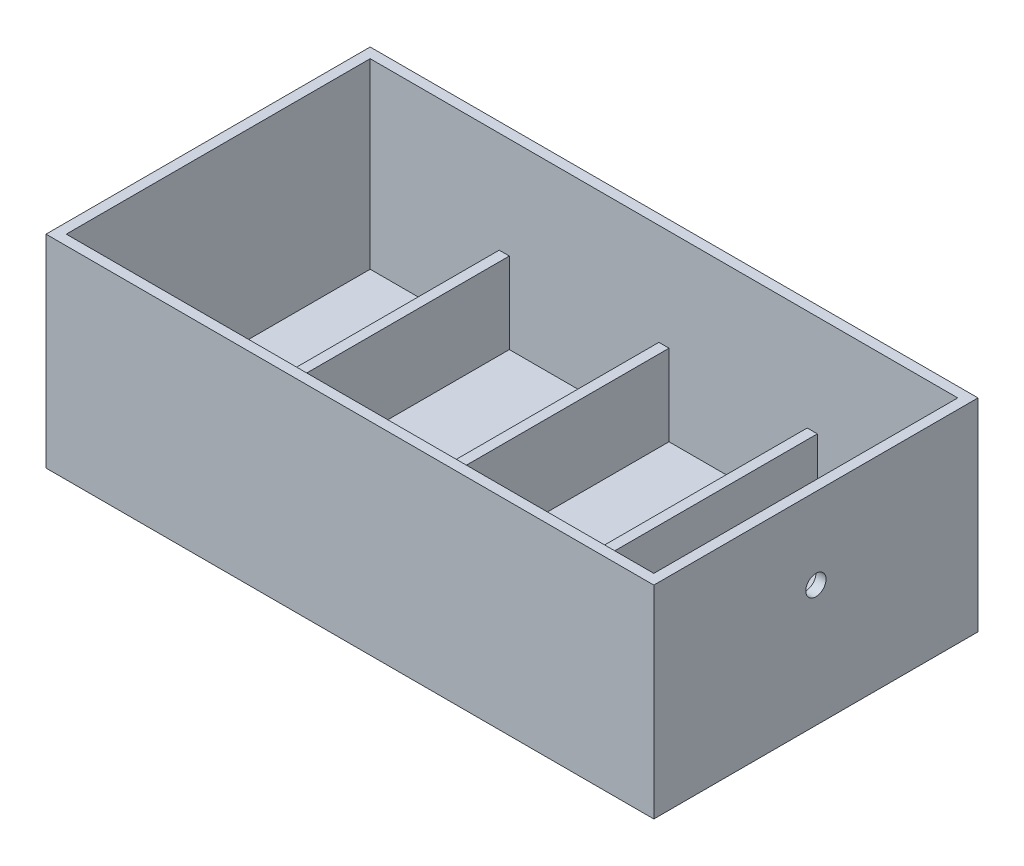
ISO-10303-21;
HEADER;
FILE_DESCRIPTION(('STEP AP214'),'2;1');
FILE_NAME('part.step','',(''),(''),'','','');
FILE_SCHEMA(('AUTOMOTIVE_DESIGN { 1 0 10303 214 1 1 1 1 }'));
ENDSEC;
DATA;
#1=APPLICATION_CONTEXT('core data for automotive mechanical design processes');
#2=APPLICATION_PROTOCOL_DEFINITION('international standard','automotive_design',2000,#1);
#3=PRODUCT_CONTEXT('',#1,'mechanical');
#4=PRODUCT('Part','Part','',(#3));
#5=PRODUCT_RELATED_PRODUCT_CATEGORY('part','',(#4));
#6=PRODUCT_DEFINITION_FORMATION('','',#4);
#7=PRODUCT_DEFINITION_CONTEXT('part definition',#1,'design');
#8=PRODUCT_DEFINITION('design','',#6,#7);
#9=PRODUCT_DEFINITION_SHAPE('','',#8);
#10=(LENGTH_UNIT() NAMED_UNIT(*) SI_UNIT(.MILLI.,.METRE.));
#11=(NAMED_UNIT(*) PLANE_ANGLE_UNIT() SI_UNIT($,.RADIAN.));
#12=(NAMED_UNIT(*) SI_UNIT($,.STERADIAN.) SOLID_ANGLE_UNIT());
#13=UNCERTAINTY_MEASURE_WITH_UNIT(LENGTH_MEASURE(1.E-05),#10,'distance_accuracy_value','');
#14=(GEOMETRIC_REPRESENTATION_CONTEXT(3) GLOBAL_UNCERTAINTY_ASSIGNED_CONTEXT((#13)) GLOBAL_UNIT_ASSIGNED_CONTEXT((#10,
#11,#12)) REPRESENTATION_CONTEXT('',''));
#15=CARTESIAN_POINT('',(0.,0.,0.));
#16=DIRECTION('',(0.,0.,1.));
#17=DIRECTION('',(1.,0.,0.));
#18=AXIS2_PLACEMENT_3D('',#15,#16,#17);
#19=CARTESIAN_POINT('',(72.5,5.,-37.5));
#20=DIRECTION('',(0.,0.,-1.));
#21=DIRECTION('',(-1.,0.,0.));
#22=AXIS2_PLACEMENT_3D('',#19,#20,#21);
#23=PLANE('',#22);
#24=DIRECTION('',(0.,-1.,0.));
#25=VECTOR('',#24,1.);
#26=CARTESIAN_POINT('',(35.3563232035454,25.,-37.5));
#27=LINE('',#26,#25);
#28=CARTESIAN_POINT('',(35.3563232035454,25.,-37.5));
#29=VERTEX_POINT('',#28);
#30=CARTESIAN_POINT('',(35.3563232035454,5.,-37.5));
#31=VERTEX_POINT('',#30);
#32=EDGE_CURVE('E213',#29,#31,#27,.T.);
#33=ORIENTED_EDGE('',*,*,#32,.F.);
#34=DIRECTION('',(-1.,0.,0.));
#35=VECTOR('',#34,1.);
#36=CARTESIAN_POINT('',(37.8563232035454,25.,-37.5));
#37=LINE('',#36,#35);
#38=CARTESIAN_POINT('',(37.8563232035454,25.,-37.5));
#39=VERTEX_POINT('',#38);
#40=EDGE_CURVE('E185',#39,#29,#37,.T.);
#41=ORIENTED_EDGE('',*,*,#40,.F.);
#42=DIRECTION('',(0.,-1.,0.));
#43=VECTOR('',#42,1.);
#44=CARTESIAN_POINT('',(37.8563232035454,25.,-37.5));
#45=LINE('',#44,#43);
#46=CARTESIAN_POINT('',(37.8563232035454,5.,-37.5));
#47=VERTEX_POINT('',#46);
#48=EDGE_CURVE('E220',#39,#47,#45,.T.);
#49=ORIENTED_EDGE('',*,*,#48,.T.);
#50=DIRECTION('',(-1.,0.,0.));
#51=VECTOR('',#50,1.);
#52=CARTESIAN_POINT('',(72.5,5.,-37.5));
#53=LINE('',#52,#51);
#54=CARTESIAN_POINT('',(72.5,5.,-37.5));
#55=VERTEX_POINT('',#54);
#56=EDGE_CURVE('E308',#55,#47,#53,.T.);
#57=ORIENTED_EDGE('',*,*,#56,.F.);
#58=DIRECTION('',(0.,1.,0.));
#59=VECTOR('',#58,1.);
#60=CARTESIAN_POINT('',(72.5,5.,-37.5));
#61=LINE('',#60,#59);
#62=CARTESIAN_POINT('',(72.5,50.,-37.5));
#63=VERTEX_POINT('',#62);
#64=EDGE_CURVE('E332',#55,#63,#61,.T.);
#65=ORIENTED_EDGE('',*,*,#64,.T.);
#66=DIRECTION('',(-1.,0.,0.));
#67=VECTOR('',#66,1.);
#68=CARTESIAN_POINT('',(72.5,50.,-37.5));
#69=LINE('',#68,#67);
#70=CARTESIAN_POINT('',(-72.5,50.,-37.5));
#71=VERTEX_POINT('',#70);
#72=EDGE_CURVE('E296',#63,#71,#69,.T.);
#73=ORIENTED_EDGE('',*,*,#72,.T.);
#74=DIRECTION('',(0.,1.,0.));
#75=VECTOR('',#74,1.);
#76=CARTESIAN_POINT('',(-72.5,5.,-37.5));
#77=LINE('',#76,#75);
#78=CARTESIAN_POINT('',(-72.5,5.,-37.5));
#79=VERTEX_POINT('',#78);
#80=EDGE_CURVE('E328',#79,#71,#77,.T.);
#81=ORIENTED_EDGE('',*,*,#80,.F.);
#82=CARTESIAN_POINT('',(-40.6546771130105,5.,-37.5));
#83=VERTEX_POINT('',#82);
#84=EDGE_CURVE('E307',#83,#79,#53,.T.);
#85=ORIENTED_EDGE('',*,*,#84,.F.);
#86=DIRECTION('',(0.,-1.,0.));
#87=VECTOR('',#86,1.);
#88=CARTESIAN_POINT('',(-40.6546771130105,25.,-37.5));
#89=LINE('',#88,#87);
#90=CARTESIAN_POINT('',(-40.6546771130105,25.,-37.5));
#91=VERTEX_POINT('',#90);
#92=EDGE_CURVE('E239',#91,#83,#89,.T.);
#93=ORIENTED_EDGE('',*,*,#92,.F.);
#94=DIRECTION('',(-1.,0.,0.));
#95=VECTOR('',#94,1.);
#96=CARTESIAN_POINT('',(-38.1546771130105,25.,-37.5));
#97=LINE('',#96,#95);
#98=CARTESIAN_POINT('',(-38.1546771130105,25.,-37.5));
#99=VERTEX_POINT('',#98);
#100=EDGE_CURVE('E236',#99,#91,#97,.T.);
#101=ORIENTED_EDGE('',*,*,#100,.F.);
#102=DIRECTION('',(0.,-1.,0.));
#103=VECTOR('',#102,1.);
#104=CARTESIAN_POINT('',(-38.1546771130105,25.,-37.5));
#105=LINE('',#104,#103);
#106=CARTESIAN_POINT('',(-38.1546771130105,5.,-37.5));
#107=VERTEX_POINT('',#106);
#108=EDGE_CURVE('E246',#99,#107,#105,.T.);
#109=ORIENTED_EDGE('',*,*,#108,.T.);
#110=CARTESIAN_POINT('',(-1.25,5.,-37.5));
#111=VERTEX_POINT('',#110);
#112=EDGE_CURVE('E314',#111,#107,#53,.T.);
#113=ORIENTED_EDGE('',*,*,#112,.F.);
#114=DIRECTION('',(0.,-1.,0.));
#115=VECTOR('',#114,1.);
#116=CARTESIAN_POINT('',(-1.25,25.,-37.5));
#117=LINE('',#116,#115);
#118=CARTESIAN_POINT('',(-1.25,25.,-37.5));
#119=VERTEX_POINT('',#118);
#120=EDGE_CURVE('E270',#119,#111,#117,.T.);
#121=ORIENTED_EDGE('',*,*,#120,.F.);
#122=DIRECTION('',(-1.,0.,0.));
#123=VECTOR('',#122,1.);
#124=CARTESIAN_POINT('',(1.25,25.,-37.5));
#125=LINE('',#124,#123);
#126=CARTESIAN_POINT('',(1.25,25.,-37.5));
#127=VERTEX_POINT('',#126);
#128=EDGE_CURVE('E267',#127,#119,#125,.T.);
#129=ORIENTED_EDGE('',*,*,#128,.F.);
#130=DIRECTION('',(0.,-1.,0.));
#131=VECTOR('',#130,1.);
#132=CARTESIAN_POINT('',(1.25,25.,-37.5));
#133=LINE('',#132,#131);
#134=CARTESIAN_POINT('',(1.25,5.,-37.5));
#135=VERTEX_POINT('',#134);
#136=EDGE_CURVE('E279',#127,#135,#133,.T.);
#137=ORIENTED_EDGE('',*,*,#136,.T.);
#138=EDGE_CURVE('E313',#31,#135,#53,.T.);
#139=ORIENTED_EDGE('',*,*,#138,.F.);
#140=EDGE_LOOP('',(#33,#41,#49,#57,#65,#73,#81,#85,#93,#101,#109,#113,#121,#129,#137,#139));
#141=FACE_BOUND('',#140,.T.);
#142=ADVANCED_FACE('F39',(#141),#23,.F.);
#143=CARTESIAN_POINT('',(72.5,5.,37.5));
#144=DIRECTION('',(0.,0.,1.));
#145=DIRECTION('',(1.,0.,0.));
#146=AXIS2_PLACEMENT_3D('',#143,#144,#145);
#147=PLANE('',#146);
#148=DIRECTION('',(0.,-1.,0.));
#149=VECTOR('',#148,1.);
#150=CARTESIAN_POINT('',(35.3563232035454,25.,37.5));
#151=LINE('',#150,#149);
#152=CARTESIAN_POINT('',(35.3563232035454,25.,37.5));
#153=VERTEX_POINT('',#152);
#154=CARTESIAN_POINT('',(35.3563232035454,5.,37.5));
#155=VERTEX_POINT('',#154);
#156=EDGE_CURVE('E192',#153,#155,#151,.T.);
#157=ORIENTED_EDGE('',*,*,#156,.T.);
#158=DIRECTION('',(1.,0.,0.));
#159=VECTOR('',#158,1.);
#160=CARTESIAN_POINT('',(72.5,5.,37.5));
#161=LINE('',#160,#159);
#162=CARTESIAN_POINT('',(1.25,5.,37.5));
#163=VERTEX_POINT('',#162);
#164=EDGE_CURVE('E303',#163,#155,#161,.T.);
#165=ORIENTED_EDGE('',*,*,#164,.F.);
#166=DIRECTION('',(0.,-1.,0.));
#167=VECTOR('',#166,1.);
#168=CARTESIAN_POINT('',(1.25,25.,37.5));
#169=LINE('',#168,#167);
#170=CARTESIAN_POINT('',(1.25,25.,37.5));
#171=VERTEX_POINT('',#170);
#172=EDGE_CURVE('E283',#171,#163,#169,.T.);
#173=ORIENTED_EDGE('',*,*,#172,.F.);
#174=DIRECTION('',(1.,0.,0.));
#175=VECTOR('',#174,1.);
#176=CARTESIAN_POINT('',(1.25,25.,37.5));
#177=LINE('',#176,#175);
#178=CARTESIAN_POINT('',(-1.25,25.,37.5));
#179=VERTEX_POINT('',#178);
#180=EDGE_CURVE('E260',#179,#171,#177,.T.);
#181=ORIENTED_EDGE('',*,*,#180,.F.);
#182=DIRECTION('',(0.,-1.,0.));
#183=VECTOR('',#182,1.);
#184=CARTESIAN_POINT('',(-1.25,25.,37.5));
#185=LINE('',#184,#183);
#186=CARTESIAN_POINT('',(-1.25,5.,37.5));
#187=VERTEX_POINT('',#186);
#188=EDGE_CURVE('E286',#179,#187,#185,.T.);
#189=ORIENTED_EDGE('',*,*,#188,.T.);
#190=CARTESIAN_POINT('',(-38.1546771130105,5.,37.5));
#191=VERTEX_POINT('',#190);
#192=EDGE_CURVE('E302',#191,#187,#161,.T.);
#193=ORIENTED_EDGE('',*,*,#192,.F.);
#194=DIRECTION('',(0.,-1.,0.));
#195=VECTOR('',#194,1.);
#196=CARTESIAN_POINT('',(-38.1546771130105,25.,37.5));
#197=LINE('',#196,#195);
#198=CARTESIAN_POINT('',(-38.1546771130105,25.,37.5));
#199=VERTEX_POINT('',#198);
#200=EDGE_CURVE('E64',#199,#191,#197,.T.);
#201=ORIENTED_EDGE('',*,*,#200,.F.);
#202=DIRECTION('',(1.,0.,0.));
#203=VECTOR('',#202,1.);
#204=CARTESIAN_POINT('',(-38.1546771130105,25.,37.5));
#205=LINE('',#204,#203);
#206=CARTESIAN_POINT('',(-40.6546771130105,25.,37.5));
#207=VERTEX_POINT('',#206);
#208=EDGE_CURVE('E229',#207,#199,#205,.T.);
#209=ORIENTED_EDGE('',*,*,#208,.F.);
#210=DIRECTION('',(0.,-1.,0.));
#211=VECTOR('',#210,1.);
#212=CARTESIAN_POINT('',(-40.6546771130105,25.,37.5));
#213=LINE('',#212,#211);
#214=CARTESIAN_POINT('',(-40.6546771130105,5.,37.5));
#215=VERTEX_POINT('',#214);
#216=EDGE_CURVE('E252',#207,#215,#213,.T.);
#217=ORIENTED_EDGE('',*,*,#216,.T.);
#218=CARTESIAN_POINT('',(-72.5,5.,37.5));
#219=VERTEX_POINT('',#218);
#220=EDGE_CURVE('E297',#219,#215,#161,.T.);
#221=ORIENTED_EDGE('',*,*,#220,.F.);
#222=DIRECTION('',(0.,1.,0.));
#223=VECTOR('',#222,1.);
#224=CARTESIAN_POINT('',(-72.5,5.,37.5));
#225=LINE('',#224,#223);
#226=CARTESIAN_POINT('',(-72.5,50.,37.5));
#227=VERTEX_POINT('',#226);
#228=EDGE_CURVE('E312',#219,#227,#225,.T.);
#229=ORIENTED_EDGE('',*,*,#228,.T.);
#230=DIRECTION('',(1.,0.,0.));
#231=VECTOR('',#230,1.);
#232=CARTESIAN_POINT('',(72.5,50.,37.5));
#233=LINE('',#232,#231);
#234=CARTESIAN_POINT('',(72.5,50.,37.5));
#235=VERTEX_POINT('',#234);
#236=EDGE_CURVE('E317',#227,#235,#233,.T.);
#237=ORIENTED_EDGE('',*,*,#236,.T.);
#238=DIRECTION('',(0.,1.,0.));
#239=VECTOR('',#238,1.);
#240=CARTESIAN_POINT('',(72.5,5.,37.5));
#241=LINE('',#240,#239);
#242=CARTESIAN_POINT('',(72.5,5.,37.5));
#243=VERTEX_POINT('',#242);
#244=EDGE_CURVE('E335',#243,#235,#241,.T.);
#245=ORIENTED_EDGE('',*,*,#244,.F.);
#246=CARTESIAN_POINT('',(37.8563232035454,5.,37.5));
#247=VERTEX_POINT('',#246);
#248=EDGE_CURVE('E295',#247,#243,#161,.T.);
#249=ORIENTED_EDGE('',*,*,#248,.F.);
#250=DIRECTION('',(0.,-1.,0.));
#251=VECTOR('',#250,1.);
#252=CARTESIAN_POINT('',(37.8563232035454,25.,37.5));
#253=LINE('',#252,#251);
#254=CARTESIAN_POINT('',(37.8563232035454,25.,37.5));
#255=VERTEX_POINT('',#254);
#256=EDGE_CURVE('E56',#255,#247,#253,.T.);
#257=ORIENTED_EDGE('',*,*,#256,.F.);
#258=DIRECTION('',(1.,0.,0.));
#259=VECTOR('',#258,1.);
#260=CARTESIAN_POINT('',(37.8563232035454,25.,37.5));
#261=LINE('',#260,#259);
#262=EDGE_CURVE('E183',#153,#255,#261,.T.);
#263=ORIENTED_EDGE('',*,*,#262,.F.);
#264=EDGE_LOOP('',(#157,#165,#173,#181,#189,#193,#201,#209,#217,#221,#229,#237,#245,#249,#257,#263));
#265=FACE_BOUND('',#264,.T.);
#266=ADVANCED_FACE('F202',(#265),#147,.F.);
#267=CARTESIAN_POINT('',(0.,5.,0.));
#268=DIRECTION('',(0.,1.,0.));
#269=DIRECTION('',(0.,0.,1.));
#270=AXIS2_PLACEMENT_3D('',#267,#268,#269);
#271=PLANE('',#270);
#272=ORIENTED_EDGE('',*,*,#164,.T.);
#273=DIRECTION('',(0.,0.,1.));
#274=VECTOR('',#273,1.);
#275=CARTESIAN_POINT('',(35.3563232035454,5.,37.5));
#276=LINE('',#275,#274);
#277=EDGE_CURVE('E195',#31,#155,#276,.T.);
#278=ORIENTED_EDGE('',*,*,#277,.F.);
#279=ORIENTED_EDGE('',*,*,#138,.T.);
#280=DIRECTION('',(0.,0.,-1.));
#281=VECTOR('',#280,1.);
#282=CARTESIAN_POINT('',(1.25,5.,37.5));
#283=LINE('',#282,#281);
#284=EDGE_CURVE('E261',#163,#135,#283,.T.);
#285=ORIENTED_EDGE('',*,*,#284,.F.);
#286=EDGE_LOOP('',(#272,#278,#279,#285));
#287=FACE_BOUND('',#286,.T.);
#288=ADVANCED_FACE('F411',(#287),#271,.T.);
#289=ORIENTED_EDGE('',*,*,#56,.T.);
#290=DIRECTION('',(0.,0.,-1.));
#291=VECTOR('',#290,1.);
#292=CARTESIAN_POINT('',(37.8563232035454,5.,37.5));
#293=LINE('',#292,#291);
#294=EDGE_CURVE('E189',#247,#47,#293,.T.);
#295=ORIENTED_EDGE('',*,*,#294,.F.);
#296=ORIENTED_EDGE('',*,*,#248,.T.);
#297=DIRECTION('',(0.,0.,-1.));
#298=VECTOR('',#297,1.);
#299=CARTESIAN_POINT('',(72.5,5.,37.5));
#300=LINE('',#299,#298);
#301=EDGE_CURVE('E301',#243,#55,#300,.T.);
#302=ORIENTED_EDGE('',*,*,#301,.T.);
#303=EDGE_LOOP('',(#289,#295,#296,#302));
#304=FACE_BOUND('',#303,.T.);
#305=ADVANCED_FACE('F552',(#304),#271,.T.);
#306=ORIENTED_EDGE('',*,*,#220,.T.);
#307=DIRECTION('',(0.,0.,1.));
#308=VECTOR('',#307,1.);
#309=CARTESIAN_POINT('',(-40.6546771130105,5.,37.5));
#310=LINE('',#309,#308);
#311=EDGE_CURVE('E200',#83,#215,#310,.T.);
#312=ORIENTED_EDGE('',*,*,#311,.F.);
#313=ORIENTED_EDGE('',*,*,#84,.T.);
#314=DIRECTION('',(0.,0.,1.));
#315=VECTOR('',#314,1.);
#316=CARTESIAN_POINT('',(-72.5,5.,37.5));
#317=LINE('',#316,#315);
#318=EDGE_CURVE('E291',#79,#219,#317,.T.);
#319=ORIENTED_EDGE('',*,*,#318,.T.);
#320=EDGE_LOOP('',(#306,#312,#313,#319));
#321=FACE_BOUND('',#320,.T.);
#322=ADVANCED_FACE('F415',(#321),#271,.T.);
#323=ORIENTED_EDGE('',*,*,#112,.T.);
#324=DIRECTION('',(0.,0.,-1.));
#325=VECTOR('',#324,1.);
#326=CARTESIAN_POINT('',(-38.1546771130105,5.,37.5));
#327=LINE('',#326,#325);
#328=EDGE_CURVE('E230',#191,#107,#327,.T.);
#329=ORIENTED_EDGE('',*,*,#328,.F.);
#330=ORIENTED_EDGE('',*,*,#192,.T.);
#331=DIRECTION('',(0.,0.,1.));
#332=VECTOR('',#331,1.);
#333=CARTESIAN_POINT('',(-1.25,5.,37.5));
#334=LINE('',#333,#332);
#335=EDGE_CURVE('E256',#111,#187,#334,.T.);
#336=ORIENTED_EDGE('',*,*,#335,.F.);
#337=EDGE_LOOP('',(#323,#329,#330,#336));
#338=FACE_BOUND('',#337,.T.);
#339=ADVANCED_FACE('F404',(#338),#271,.T.);
#340=CARTESIAN_POINT('',(-75.,50.,40.));
#341=DIRECTION('',(1.,0.,0.));
#342=DIRECTION('',(0.,0.,-1.));
#343=AXIS2_PLACEMENT_3D('',#340,#341,#342);
#344=PLANE('',#343);
#345=DIRECTION('',(0.,0.,1.));
#346=VECTOR('',#345,1.);
#347=CARTESIAN_POINT('',(-75.,0.,40.));
#348=LINE('',#347,#346);
#349=CARTESIAN_POINT('',(-75.,0.,-40.));
#350=VERTEX_POINT('',#349);
#351=CARTESIAN_POINT('',(-75.,0.,40.));
#352=VERTEX_POINT('',#351);
#353=EDGE_CURVE('E331',#350,#352,#348,.T.);
#354=ORIENTED_EDGE('',*,*,#353,.T.);
#355=DIRECTION('',(0.,-1.,0.));
#356=VECTOR('',#355,1.);
#357=CARTESIAN_POINT('',(-75.,50.,40.));
#358=LINE('',#357,#356);
#359=CARTESIAN_POINT('',(-75.,50.,40.));
#360=VERTEX_POINT('',#359);
#361=EDGE_CURVE('E11',#360,#352,#358,.T.);
#362=ORIENTED_EDGE('',*,*,#361,.F.);
#363=DIRECTION('',(0.,0.,1.));
#364=VECTOR('',#363,1.);
#365=CARTESIAN_POINT('',(-75.,50.,40.));
#366=LINE('',#365,#364);
#367=CARTESIAN_POINT('',(-75.,50.,-40.));
#368=VERTEX_POINT('',#367);
#369=EDGE_CURVE('E341',#368,#360,#366,.T.);
#370=ORIENTED_EDGE('',*,*,#369,.F.);
#371=DIRECTION('',(0.,-1.,0.));
#372=VECTOR('',#371,1.);
#373=CARTESIAN_POINT('',(-75.,50.,-40.));
#374=LINE('',#373,#372);
#375=EDGE_CURVE('E355',#368,#350,#374,.T.);
#376=ORIENTED_EDGE('',*,*,#375,.T.);
#377=EDGE_LOOP('',(#354,#362,#370,#376));
#378=FACE_BOUND('',#377,.T.);
#379=ADVANCED_FACE('F41',(#378),#344,.F.);
#380=CARTESIAN_POINT('',(75.,50.,40.));
#381=DIRECTION('',(0.,0.,-1.));
#382=DIRECTION('',(-1.,0.,0.));
#383=AXIS2_PLACEMENT_3D('',#380,#381,#382);
#384=PLANE('',#383);
#385=DIRECTION('',(1.,0.,0.));
#386=VECTOR('',#385,1.);
#387=CARTESIAN_POINT('',(75.,0.,40.));
#388=LINE('',#387,#386);
#389=CARTESIAN_POINT('',(75.,0.,40.));
#390=VERTEX_POINT('',#389);
#391=EDGE_CURVE('E359',#352,#390,#388,.T.);
#392=ORIENTED_EDGE('',*,*,#391,.T.);
#393=DIRECTION('',(0.,-1.,0.));
#394=VECTOR('',#393,1.);
#395=CARTESIAN_POINT('',(75.,50.,40.));
#396=LINE('',#395,#394);
#397=CARTESIAN_POINT('',(75.,50.,40.));
#398=VERTEX_POINT('',#397);
#399=EDGE_CURVE('E49',#398,#390,#396,.T.);
#400=ORIENTED_EDGE('',*,*,#399,.F.);
#401=DIRECTION('',(1.,0.,0.));
#402=VECTOR('',#401,1.);
#403=CARTESIAN_POINT('',(75.,50.,40.));
#404=LINE('',#403,#402);
#405=EDGE_CURVE('E345',#360,#398,#404,.T.);
#406=ORIENTED_EDGE('',*,*,#405,.F.);
#407=ORIENTED_EDGE('',*,*,#361,.T.);
#408=EDGE_LOOP('',(#392,#400,#406,#407));
#409=FACE_BOUND('',#408,.T.);
#410=ADVANCED_FACE('F396',(#409),#384,.F.);
#411=CARTESIAN_POINT('',(75.,50.,40.));
#412=DIRECTION('',(-1.,0.,0.));
#413=DIRECTION('',(0.,0.,1.));
#414=AXIS2_PLACEMENT_3D('',#411,#412,#413);
#415=PLANE('',#414);
#416=CARTESIAN_POINT('',(75.,30.,0.));
#417=DIRECTION('',(1.,0.,0.));
#418=DIRECTION('',(0.,0.,-1.));
#419=AXIS2_PLACEMENT_3D('',#416,#417,#418);
#420=CIRCLE('',#419,2.5);
#421=CARTESIAN_POINT('',(75.,30.,-2.5));
#422=VERTEX_POINT('',#421);
#423=EDGE_CURVE('E656',#422,#422,#420,.T.);
#424=ORIENTED_EDGE('',*,*,#423,.F.);
#425=EDGE_LOOP('',(#424));
#426=FACE_BOUND('',#425,.T.);
#427=DIRECTION('',(0.,0.,-1.));
#428=VECTOR('',#427,1.);
#429=CARTESIAN_POINT('',(75.,0.,40.));
#430=LINE('',#429,#428);
#431=CARTESIAN_POINT('',(75.,0.,-40.));
#432=VERTEX_POINT('',#431);
#433=EDGE_CURVE('E362',#390,#432,#430,.T.);
#434=ORIENTED_EDGE('',*,*,#433,.T.);
#435=DIRECTION('',(0.,-1.,0.));
#436=VECTOR('',#435,1.);
#437=CARTESIAN_POINT('',(75.,50.,-40.));
#438=LINE('',#437,#436);
#439=CARTESIAN_POINT('',(75.,50.,-40.));
#440=VERTEX_POINT('',#439);
#441=EDGE_CURVE('E370',#440,#432,#438,.T.);
#442=ORIENTED_EDGE('',*,*,#441,.F.);
#443=DIRECTION('',(0.,0.,-1.));
#444=VECTOR('',#443,1.);
#445=CARTESIAN_POINT('',(75.,50.,40.));
#446=LINE('',#445,#444);
#447=EDGE_CURVE('E349',#398,#440,#446,.T.);
#448=ORIENTED_EDGE('',*,*,#447,.F.);
#449=ORIENTED_EDGE('',*,*,#399,.T.);
#450=EDGE_LOOP('',(#434,#442,#448,#449));
#451=FACE_BOUND('',#450,.T.);
#452=ADVANCED_FACE('F380',(#426,#451),#415,.F.);
#453=CARTESIAN_POINT('',(75.,50.,-40.));
#454=DIRECTION('',(0.,0.,1.));
#455=DIRECTION('',(1.,0.,0.));
#456=AXIS2_PLACEMENT_3D('',#453,#454,#455);
#457=PLANE('',#456);
#458=DIRECTION('',(-1.,0.,0.));
#459=VECTOR('',#458,1.);
#460=CARTESIAN_POINT('',(75.,0.,-40.));
#461=LINE('',#460,#459);
#462=EDGE_CURVE('E346',#432,#350,#461,.T.);
#463=ORIENTED_EDGE('',*,*,#462,.T.);
#464=ORIENTED_EDGE('',*,*,#375,.F.);
#465=DIRECTION('',(-1.,0.,0.));
#466=VECTOR('',#465,1.);
#467=CARTESIAN_POINT('',(75.,50.,-40.));
#468=LINE('',#467,#466);
#469=EDGE_CURVE('E352',#440,#368,#468,.T.);
#470=ORIENTED_EDGE('',*,*,#469,.F.);
#471=ORIENTED_EDGE('',*,*,#441,.T.);
#472=EDGE_LOOP('',(#463,#464,#470,#471));
#473=FACE_BOUND('',#472,.T.);
#474=ADVANCED_FACE('F389',(#473),#457,.F.);
#475=CARTESIAN_POINT('',(0.,50.,0.));
#476=DIRECTION('',(0.,1.,0.));
#477=DIRECTION('',(0.,0.,1.));
#478=AXIS2_PLACEMENT_3D('',#475,#476,#477);
#479=PLANE('',#478);
#480=DIRECTION('',(0.,0.,1.));
#481=VECTOR('',#480,1.);
#482=CARTESIAN_POINT('',(-72.5,50.,37.5));
#483=LINE('',#482,#481);
#484=EDGE_CURVE('E290',#71,#227,#483,.T.);
#485=ORIENTED_EDGE('',*,*,#484,.F.);
#486=ORIENTED_EDGE('',*,*,#72,.F.);
#487=DIRECTION('',(0.,0.,-1.));
#488=VECTOR('',#487,1.);
#489=CARTESIAN_POINT('',(72.5,50.,37.5));
#490=LINE('',#489,#488);
#491=EDGE_CURVE('E321',#235,#63,#490,.T.);
#492=ORIENTED_EDGE('',*,*,#491,.F.);
#493=ORIENTED_EDGE('',*,*,#236,.F.);
#494=EDGE_LOOP('',(#485,#486,#492,#493));
#495=FACE_BOUND('',#494,.T.);
#496=ORIENTED_EDGE('',*,*,#369,.T.);
#497=ORIENTED_EDGE('',*,*,#405,.T.);
#498=ORIENTED_EDGE('',*,*,#447,.T.);
#499=ORIENTED_EDGE('',*,*,#469,.T.);
#500=EDGE_LOOP('',(#496,#497,#498,#499));
#501=FACE_BOUND('',#500,.T.);
#502=ADVANCED_FACE('F395',(#495,#501),#479,.T.);
#503=CARTESIAN_POINT('',(0.,0.,0.));
#504=DIRECTION('',(0.,1.,0.));
#505=DIRECTION('',(0.,0.,1.));
#506=AXIS2_PLACEMENT_3D('',#503,#504,#505);
#507=PLANE('',#506);
#508=ORIENTED_EDGE('',*,*,#353,.F.);
#509=ORIENTED_EDGE('',*,*,#462,.F.);
#510=ORIENTED_EDGE('',*,*,#433,.F.);
#511=ORIENTED_EDGE('',*,*,#391,.F.);
#512=EDGE_LOOP('',(#508,#509,#510,#511));
#513=FACE_BOUND('',#512,.T.);
#514=ADVANCED_FACE('F386',(#513),#507,.F.);
#515=CARTESIAN_POINT('',(-72.5,5.,37.5));
#516=DIRECTION('',(-1.,0.,0.));
#517=DIRECTION('',(0.,0.,1.));
#518=AXIS2_PLACEMENT_3D('',#515,#516,#517);
#519=PLANE('',#518);
#520=ORIENTED_EDGE('',*,*,#484,.T.);
#521=ORIENTED_EDGE('',*,*,#228,.F.);
#522=ORIENTED_EDGE('',*,*,#318,.F.);
#523=ORIENTED_EDGE('',*,*,#80,.T.);
#524=EDGE_LOOP('',(#520,#521,#522,#523));
#525=FACE_BOUND('',#524,.T.);
#526=ADVANCED_FACE('F420',(#525),#519,.F.);
#527=CARTESIAN_POINT('',(72.5,5.,37.5));
#528=DIRECTION('',(1.,0.,0.));
#529=DIRECTION('',(0.,0.,-1.));
#530=AXIS2_PLACEMENT_3D('',#527,#528,#529);
#531=PLANE('',#530);
#532=CARTESIAN_POINT('',(72.5,30.,0.));
#533=DIRECTION('',(1.,0.,0.));
#534=DIRECTION('',(0.,0.,-1.));
#535=AXIS2_PLACEMENT_3D('',#532,#533,#534);
#536=CIRCLE('',#535,2.5);
#537=CARTESIAN_POINT('',(72.5,30.,-2.5));
#538=VERTEX_POINT('',#537);
#539=EDGE_CURVE('E43',#538,#538,#536,.T.);
#540=ORIENTED_EDGE('',*,*,#539,.T.);
#541=EDGE_LOOP('',(#540));
#542=FACE_BOUND('',#541,.T.);
#543=ORIENTED_EDGE('',*,*,#491,.T.);
#544=ORIENTED_EDGE('',*,*,#64,.F.);
#545=ORIENTED_EDGE('',*,*,#301,.F.);
#546=ORIENTED_EDGE('',*,*,#244,.T.);
#547=EDGE_LOOP('',(#543,#544,#545,#546));
#548=FACE_BOUND('',#547,.T.);
#549=ADVANCED_FACE('F417',(#542,#548),#531,.F.);
#550=CARTESIAN_POINT('',(-1.25,25.,37.5));
#551=DIRECTION('',(1.,0.,0.));
#552=DIRECTION('',(0.,0.,-1.));
#553=AXIS2_PLACEMENT_3D('',#550,#551,#552);
#554=PLANE('',#553);
#555=ORIENTED_EDGE('',*,*,#335,.T.);
#556=ORIENTED_EDGE('',*,*,#188,.F.);
#557=DIRECTION('',(0.,0.,1.));
#558=VECTOR('',#557,1.);
#559=CARTESIAN_POINT('',(-1.25,25.,37.5));
#560=LINE('',#559,#558);
#561=EDGE_CURVE('E257',#119,#179,#560,.T.);
#562=ORIENTED_EDGE('',*,*,#561,.F.);
#563=ORIENTED_EDGE('',*,*,#120,.T.);
#564=EDGE_LOOP('',(#555,#556,#562,#563));
#565=FACE_BOUND('',#564,.T.);
#566=ADVANCED_FACE('F419',(#565),#554,.F.);
#567=CARTESIAN_POINT('',(1.25,25.,37.5));
#568=DIRECTION('',(-1.,0.,0.));
#569=DIRECTION('',(0.,0.,1.));
#570=AXIS2_PLACEMENT_3D('',#567,#568,#569);
#571=PLANE('',#570);
#572=ORIENTED_EDGE('',*,*,#284,.T.);
#573=ORIENTED_EDGE('',*,*,#136,.F.);
#574=DIRECTION('',(0.,0.,-1.));
#575=VECTOR('',#574,1.);
#576=CARTESIAN_POINT('',(1.25,25.,37.5));
#577=LINE('',#576,#575);
#578=EDGE_CURVE('E264',#171,#127,#577,.T.);
#579=ORIENTED_EDGE('',*,*,#578,.F.);
#580=ORIENTED_EDGE('',*,*,#172,.T.);
#581=EDGE_LOOP('',(#572,#573,#579,#580));
#582=FACE_BOUND('',#581,.T.);
#583=ADVANCED_FACE('F459',(#582),#571,.F.);
#584=CARTESIAN_POINT('',(0.,25.,0.));
#585=DIRECTION('',(0.,1.,0.));
#586=DIRECTION('',(0.,0.,1.));
#587=AXIS2_PLACEMENT_3D('',#584,#585,#586);
#588=PLANE('',#587);
#589=ORIENTED_EDGE('',*,*,#561,.T.);
#590=ORIENTED_EDGE('',*,*,#180,.T.);
#591=ORIENTED_EDGE('',*,*,#578,.T.);
#592=ORIENTED_EDGE('',*,*,#128,.T.);
#593=EDGE_LOOP('',(#589,#590,#591,#592));
#594=FACE_BOUND('',#593,.T.);
#595=ADVANCED_FACE('F466',(#594),#588,.T.);
#596=CARTESIAN_POINT('',(-40.6546771130105,25.,37.5));
#597=DIRECTION('',(1.,0.,0.));
#598=DIRECTION('',(0.,0.,-1.));
#599=AXIS2_PLACEMENT_3D('',#596,#597,#598);
#600=PLANE('',#599);
#601=ORIENTED_EDGE('',*,*,#311,.T.);
#602=ORIENTED_EDGE('',*,*,#216,.F.);
#603=DIRECTION('',(0.,0.,1.));
#604=VECTOR('',#603,1.);
#605=CARTESIAN_POINT('',(-40.6546771130105,25.,37.5));
#606=LINE('',#605,#604);
#607=EDGE_CURVE('E226',#91,#207,#606,.T.);
#608=ORIENTED_EDGE('',*,*,#607,.F.);
#609=ORIENTED_EDGE('',*,*,#92,.T.);
#610=EDGE_LOOP('',(#601,#602,#608,#609));
#611=FACE_BOUND('',#610,.T.);
#612=ADVANCED_FACE('F474',(#611),#600,.F.);
#613=CARTESIAN_POINT('',(-38.1546771130105,25.,37.5));
#614=DIRECTION('',(-1.,0.,0.));
#615=DIRECTION('',(0.,0.,1.));
#616=AXIS2_PLACEMENT_3D('',#613,#614,#615);
#617=PLANE('',#616);
#618=ORIENTED_EDGE('',*,*,#328,.T.);
#619=ORIENTED_EDGE('',*,*,#108,.F.);
#620=DIRECTION('',(0.,0.,-1.));
#621=VECTOR('',#620,1.);
#622=CARTESIAN_POINT('',(-38.1546771130105,25.,37.5));
#623=LINE('',#622,#621);
#624=EDGE_CURVE('E233',#199,#99,#623,.T.);
#625=ORIENTED_EDGE('',*,*,#624,.F.);
#626=ORIENTED_EDGE('',*,*,#200,.T.);
#627=EDGE_LOOP('',(#618,#619,#625,#626));
#628=FACE_BOUND('',#627,.T.);
#629=ADVANCED_FACE('F483',(#628),#617,.F.);
#630=CARTESIAN_POINT('',(0.,25.,0.));
#631=DIRECTION('',(0.,1.,0.));
#632=DIRECTION('',(0.,0.,1.));
#633=AXIS2_PLACEMENT_3D('',#630,#631,#632);
#634=PLANE('',#633);
#635=ORIENTED_EDGE('',*,*,#607,.T.);
#636=ORIENTED_EDGE('',*,*,#208,.T.);
#637=ORIENTED_EDGE('',*,*,#624,.T.);
#638=ORIENTED_EDGE('',*,*,#100,.T.);
#639=EDGE_LOOP('',(#635,#636,#637,#638));
#640=FACE_BOUND('',#639,.T.);
#641=ADVANCED_FACE('F492',(#640),#634,.T.);
#642=CARTESIAN_POINT('',(35.3563232035454,25.,37.5));
#643=DIRECTION('',(1.,0.,0.));
#644=DIRECTION('',(0.,0.,-1.));
#645=AXIS2_PLACEMENT_3D('',#642,#643,#644);
#646=PLANE('',#645);
#647=ORIENTED_EDGE('',*,*,#277,.T.);
#648=ORIENTED_EDGE('',*,*,#156,.F.);
#649=DIRECTION('',(0.,0.,1.));
#650=VECTOR('',#649,1.);
#651=CARTESIAN_POINT('',(35.3563232035454,25.,37.5));
#652=LINE('',#651,#650);
#653=EDGE_CURVE('E179',#29,#153,#652,.T.);
#654=ORIENTED_EDGE('',*,*,#653,.F.);
#655=ORIENTED_EDGE('',*,*,#32,.T.);
#656=EDGE_LOOP('',(#647,#648,#654,#655));
#657=FACE_BOUND('',#656,.T.);
#658=ADVANCED_FACE('F193',(#657),#646,.F.);
#659=CARTESIAN_POINT('',(37.8563232035454,25.,37.5));
#660=DIRECTION('',(-1.,0.,0.));
#661=DIRECTION('',(0.,0.,1.));
#662=AXIS2_PLACEMENT_3D('',#659,#660,#661);
#663=PLANE('',#662);
#664=ORIENTED_EDGE('',*,*,#294,.T.);
#665=ORIENTED_EDGE('',*,*,#48,.F.);
#666=DIRECTION('',(0.,0.,-1.));
#667=VECTOR('',#666,1.);
#668=CARTESIAN_POINT('',(37.8563232035454,25.,37.5));
#669=LINE('',#668,#667);
#670=EDGE_CURVE('E205',#255,#39,#669,.T.);
#671=ORIENTED_EDGE('',*,*,#670,.F.);
#672=ORIENTED_EDGE('',*,*,#256,.T.);
#673=EDGE_LOOP('',(#664,#665,#671,#672));
#674=FACE_BOUND('',#673,.T.);
#675=ADVANCED_FACE('F506',(#674),#663,.F.);
#676=CARTESIAN_POINT('',(0.,25.,0.));
#677=DIRECTION('',(0.,1.,0.));
#678=DIRECTION('',(0.,0.,1.));
#679=AXIS2_PLACEMENT_3D('',#676,#677,#678);
#680=PLANE('',#679);
#681=ORIENTED_EDGE('',*,*,#653,.T.);
#682=ORIENTED_EDGE('',*,*,#262,.T.);
#683=ORIENTED_EDGE('',*,*,#670,.T.);
#684=ORIENTED_EDGE('',*,*,#40,.T.);
#685=EDGE_LOOP('',(#681,#682,#683,#684));
#686=FACE_BOUND('',#685,.T.);
#687=ADVANCED_FACE('F181',(#686),#680,.T.);
#688=CARTESIAN_POINT('',(65.,30.,0.));
#689=DIRECTION('',(1.,0.,0.));
#690=DIRECTION('',(0.,0.,-1.));
#691=AXIS2_PLACEMENT_3D('',#688,#689,#690);
#692=CYLINDRICAL_SURFACE('',#691,2.5);
#693=ORIENTED_EDGE('',*,*,#423,.T.);
#694=EDGE_LOOP('',(#693));
#695=FACE_BOUND('',#694,.T.);
#696=ORIENTED_EDGE('',*,*,#539,.F.);
#697=EDGE_LOOP('',(#696));
#698=FACE_BOUND('',#697,.T.);
#699=ADVANCED_FACE('F520',(#695,#698),#692,.F.);
#700=CLOSED_SHELL('',(#142,#266,#288,#305,#322,#339,#379,#410,#452,#474,#502,#514,#526,#549,
#566,#583,#595,#612,#629,#641,#658,#675,#687,#699));
#701=MANIFOLD_SOLID_BREP('B2',#700);
#702=ADVANCED_BREP_SHAPE_REPRESENTATION('',(#18,#701),#14);
#703=SHAPE_DEFINITION_REPRESENTATION(#9,#702);
ENDSEC;
END-ISO-10303-21;
